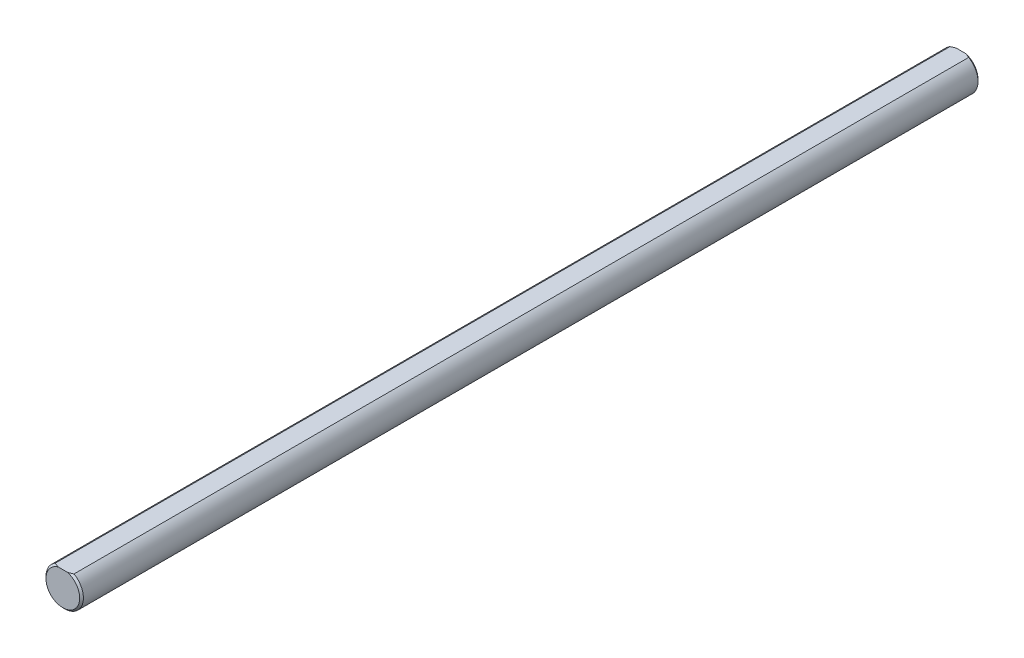
ISO-10303-21;
HEADER;
FILE_DESCRIPTION(('STEP AP214'),'2;1');
FILE_NAME('part.step','',(''),(''),'','','');
FILE_SCHEMA(('AUTOMOTIVE_DESIGN { 1 0 10303 214 1 1 1 1 }'));
ENDSEC;
DATA;
#1=APPLICATION_CONTEXT('core data for automotive mechanical design processes');
#2=APPLICATION_PROTOCOL_DEFINITION('international standard','automotive_design',2000,#1);
#3=PRODUCT_CONTEXT('',#1,'mechanical');
#4=PRODUCT('Part','Part','',(#3));
#5=PRODUCT_RELATED_PRODUCT_CATEGORY('part','',(#4));
#6=PRODUCT_DEFINITION_FORMATION('','',#4);
#7=PRODUCT_DEFINITION_CONTEXT('part definition',#1,'design');
#8=PRODUCT_DEFINITION('design','',#6,#7);
#9=PRODUCT_DEFINITION_SHAPE('','',#8);
#10=(LENGTH_UNIT() NAMED_UNIT(*) SI_UNIT(.MILLI.,.METRE.));
#11=(NAMED_UNIT(*) PLANE_ANGLE_UNIT() SI_UNIT($,.RADIAN.));
#12=(NAMED_UNIT(*) SI_UNIT($,.STERADIAN.) SOLID_ANGLE_UNIT());
#13=UNCERTAINTY_MEASURE_WITH_UNIT(LENGTH_MEASURE(1.E-05),#10,'distance_accuracy_value','');
#14=(GEOMETRIC_REPRESENTATION_CONTEXT(3) GLOBAL_UNCERTAINTY_ASSIGNED_CONTEXT((#13)) GLOBAL_UNIT_ASSIGNED_CONTEXT((#10,
#11,#12)) REPRESENTATION_CONTEXT('',''));
#15=CARTESIAN_POINT('',(0.,0.,0.));
#16=DIRECTION('',(0.,0.,1.));
#17=DIRECTION('',(1.,0.,0.));
#18=AXIS2_PLACEMENT_3D('',#15,#16,#17);
#19=CARTESIAN_POINT('',(0.,0.,76.2));
#20=DIRECTION('',(0.,0.,-1.));
#21=DIRECTION('',(-1.,0.,0.));
#22=AXIS2_PLACEMENT_3D('',#19,#20,#21);
#23=CYLINDRICAL_SURFACE('',#22,3.175);
#24=DIRECTION('',(0.,0.,1.));
#25=VECTOR('',#24,1.);
#26=CARTESIAN_POINT('',(-1.5875,2.74963065701559,-76.2));
#27=LINE('',#26,#25);
#28=CARTESIAN_POINT('',(-1.5875,2.74963065701559,-75.8824999999998));
#29=VERTEX_POINT('',#28);
#30=CARTESIAN_POINT('',(-1.5875,2.74963065701559,75.8825000000001));
#31=VERTEX_POINT('',#30);
#32=EDGE_CURVE('E87',#29,#31,#27,.T.);
#33=ORIENTED_EDGE('',*,*,#32,.F.);
#34=CARTESIAN_POINT('',(0.,0.,-75.8824999999998));
#35=DIRECTION('',(0.,0.,1.));
#36=DIRECTION('',(1.,0.,0.));
#37=AXIS2_PLACEMENT_3D('',#34,#35,#36);
#38=CIRCLE('',#37,3.175);
#39=CARTESIAN_POINT('',(1.5875,2.74963065701559,-75.8824999999998));
#40=VERTEX_POINT('',#39);
#41=EDGE_CURVE('E97',#29,#40,#38,.T.);
#42=ORIENTED_EDGE('',*,*,#41,.T.);
#43=DIRECTION('',(0.,0.,1.));
#44=VECTOR('',#43,1.);
#45=CARTESIAN_POINT('',(1.5875,2.74963065701559,-76.2));
#46=LINE('',#45,#44);
#47=CARTESIAN_POINT('',(1.5875,2.74963065701559,75.8825000000001));
#48=VERTEX_POINT('',#47);
#49=EDGE_CURVE('E100',#40,#48,#46,.T.);
#50=ORIENTED_EDGE('',*,*,#49,.T.);
#51=CARTESIAN_POINT('',(0.,0.,75.8825000000001));
#52=DIRECTION('',(0.,0.,1.));
#53=DIRECTION('',(1.,0.,0.));
#54=AXIS2_PLACEMENT_3D('',#51,#52,#53);
#55=CIRCLE('',#54,3.175);
#56=EDGE_CURVE('E96',#48,#31,#55,.F.);
#57=ORIENTED_EDGE('',*,*,#56,.T.);
#58=EDGE_LOOP('',(#33,#42,#50,#57));
#59=FACE_BOUND('',#58,.T.);
#60=ADVANCED_FACE('F39',(#59),#23,.T.);
#61=CARTESIAN_POINT('',(0.,0.,76.2));
#62=DIRECTION('',(0.,0.,1.));
#63=DIRECTION('',(1.,0.,0.));
#64=AXIS2_PLACEMENT_3D('',#61,#62,#63);
#65=PLANE('',#64);
#66=DIRECTION('',(1.,0.,0.));
#67=VECTOR('',#66,1.);
#68=CARTESIAN_POINT('',(-1.5875,2.74963065701559,76.2));
#69=LINE('',#68,#67);
#70=CARTESIAN_POINT('',(-0.777712993334062,2.74963065701559,76.2));
#71=VERTEX_POINT('',#70);
#72=CARTESIAN_POINT('',(0.777712993334062,2.74963065701559,76.2));
#73=VERTEX_POINT('',#72);
#74=EDGE_CURVE('E144',#71,#73,#69,.T.);
#75=ORIENTED_EDGE('',*,*,#74,.F.);
#76=CARTESIAN_POINT('',(0.,0.,76.2));
#77=DIRECTION('',(0.,0.,1.));
#78=DIRECTION('',(1.,0.,0.));
#79=AXIS2_PLACEMENT_3D('',#76,#77,#78);
#80=CIRCLE('',#79,2.85750000000011);
#81=EDGE_CURVE('E11',#71,#73,#80,.T.);
#82=ORIENTED_EDGE('',*,*,#81,.T.);
#83=EDGE_LOOP('',(#75,#82));
#84=FACE_BOUND('',#83,.T.);
#85=ADVANCED_FACE('F139',(#84),#65,.T.);
#86=CARTESIAN_POINT('',(0.,0.,-76.2));
#87=DIRECTION('',(0.,0.,1.));
#88=DIRECTION('',(1.,0.,0.));
#89=AXIS2_PLACEMENT_3D('',#86,#87,#88);
#90=PLANE('',#89);
#91=DIRECTION('',(1.,0.,0.));
#92=VECTOR('',#91,1.);
#93=CARTESIAN_POINT('',(-1.5875,2.74963065701559,-76.2));
#94=LINE('',#93,#92);
#95=CARTESIAN_POINT('',(-0.77771299333294,2.74963065701559,-76.2));
#96=VERTEX_POINT('',#95);
#97=CARTESIAN_POINT('',(0.77771299333294,2.74963065701559,-76.2));
#98=VERTEX_POINT('',#97);
#99=EDGE_CURVE('E89',#96,#98,#94,.T.);
#100=ORIENTED_EDGE('',*,*,#99,.T.);
#101=CARTESIAN_POINT('',(0.,0.,-76.2));
#102=DIRECTION('',(0.,0.,1.));
#103=DIRECTION('',(1.,0.,0.));
#104=AXIS2_PLACEMENT_3D('',#101,#102,#103);
#105=CIRCLE('',#104,2.8574999999998);
#106=EDGE_CURVE('E48',#98,#96,#105,.F.);
#107=ORIENTED_EDGE('',*,*,#106,.T.);
#108=EDGE_LOOP('',(#100,#107));
#109=FACE_BOUND('',#108,.T.);
#110=ADVANCED_FACE('F117',(#109),#90,.F.);
#111=CARTESIAN_POINT('',(-1.5875,2.74963065701559,-76.2));
#112=DIRECTION('',(0.,-1.,0.));
#113=DIRECTION('',(0.,0.,-1.));
#114=AXIS2_PLACEMENT_3D('',#111,#112,#113);
#115=PLANE('',#114);
#116=ORIENTED_EDGE('',*,*,#49,.F.);
#117=CARTESIAN_POINT('',(1.5875,2.74963065701559,-75.8824999999998));
#118=CARTESIAN_POINT('',(1.52250516699264,2.74963065701559,-75.9149880824797));
#119=CARTESIAN_POINT('',(1.45690188238018,2.74963065701559,-75.9463019076192));
#120=CARTESIAN_POINT('',(1.32458227076999,2.74963065701559,-76.0060258514251));
#121=CARTESIAN_POINT('',(1.25786903887704,2.74963065701559,-76.0344428470168));
#122=CARTESIAN_POINT('',(1.12308918002457,2.74963065701559,-76.0879920057044));
#123=CARTESIAN_POINT('',(1.05502199036131,2.74963065701559,-76.1131227687341));
#124=CARTESIAN_POINT('',(0.917422256787398,2.74963065701559,-76.1595821959476));
#125=CARTESIAN_POINT('',(0.84788654327487,2.74963065701559,-76.1809014355307));
#126=CARTESIAN_POINT('',(0.777712993332939,2.74963065701559,-76.2));
#127=B_SPLINE_CURVE_WITH_KNOTS('',3,(#117,#118,#119,#120,#121,#122,#123,#124,#125,#126),
.UNSPECIFIED.,.F.,.F.,(4,2,2,2,4),(0.,0.218002568777967,0.435474929897523,0.653039643131099,
0.871135095681305),.UNSPECIFIED.);
#128=EDGE_CURVE('E94',#40,#98,#127,.T.);
#129=ORIENTED_EDGE('',*,*,#128,.T.);
#130=ORIENTED_EDGE('',*,*,#99,.F.);
#131=CARTESIAN_POINT('',(-0.77771299333294,2.74963065701559,-76.2));
#132=CARTESIAN_POINT('',(-0.847886543274871,2.74963065701559,-76.1809014355307));
#133=CARTESIAN_POINT('',(-0.917422256787399,2.74963065701559,-76.1595821959476));
#134=CARTESIAN_POINT('',(-1.05502199036131,2.74963065701559,-76.1131227687341));
#135=CARTESIAN_POINT('',(-1.12308918002457,2.74963065701559,-76.0879920057044));
#136=CARTESIAN_POINT('',(-1.25786903887704,2.74963065701559,-76.0344428470168));
#137=CARTESIAN_POINT('',(-1.32458227076999,2.74963065701559,-76.0060258514251));
#138=CARTESIAN_POINT('',(-1.45690188238018,2.74963065701559,-75.9463019076192));
#139=CARTESIAN_POINT('',(-1.52250516699264,2.74963065701559,-75.9149880824797));
#140=CARTESIAN_POINT('',(-1.5875,2.74963065701559,-75.8824999999998));
#141=B_SPLINE_CURVE_WITH_KNOTS('',3,(#131,#132,#133,#134,#135,#136,#137,#138,#139,#140),
.UNSPECIFIED.,.F.,.F.,(4,2,2,2,4),(0.,0.218095452550206,0.435660165783782,0.653132526903341,
0.871135095681305),.UNSPECIFIED.);
#142=EDGE_CURVE('E84',#96,#29,#141,.T.);
#143=ORIENTED_EDGE('',*,*,#142,.T.);
#144=ORIENTED_EDGE('',*,*,#32,.T.);
#145=CARTESIAN_POINT('',(-1.5875,2.74963065701559,75.8825000000001));
#146=CARTESIAN_POINT('',(-1.52250516699273,2.74963065701559,75.91498808248));
#147=CARTESIAN_POINT('',(-1.45690188238036,2.74963065701559,75.9463019076195));
#148=CARTESIAN_POINT('',(-1.32458227077035,2.74963065701559,76.0060258514252));
#149=CARTESIAN_POINT('',(-1.25786903887749,2.74963065701559,76.0344428470169));
#150=CARTESIAN_POINT('',(-1.12308918002521,2.74963065701559,76.0879920057045));
#151=CARTESIAN_POINT('',(-1.05502199036204,2.74963065701559,76.1131227687342));
#152=CARTESIAN_POINT('',(-0.91742225678832,2.74963065701559,76.1595821959476));
#153=CARTESIAN_POINT('',(-0.847886543275889,2.74963065701559,76.1809014355307));
#154=CARTESIAN_POINT('',(-0.777712993334062,2.74963065701559,76.2));
#155=B_SPLINE_CURVE_WITH_KNOTS('',3,(#145,#146,#147,#148,#149,#150,#151,#152,#153,#154),
.UNSPECIFIED.,.F.,.F.,(4,2,2,2,4),(0.,0.218002568777676,0.435474929896942,0.653039643130223,
0.871135095680142),.UNSPECIFIED.);
#156=EDGE_CURVE('E64',#31,#71,#155,.T.);
#157=ORIENTED_EDGE('',*,*,#156,.T.);
#158=ORIENTED_EDGE('',*,*,#74,.T.);
#159=CARTESIAN_POINT('',(0.777712993334062,2.74963065701559,76.2));
#160=CARTESIAN_POINT('',(0.847886543275889,2.74963065701559,76.1809014355307));
#161=CARTESIAN_POINT('',(0.917422256788319,2.74963065701559,76.1595821959476));
#162=CARTESIAN_POINT('',(1.05502199036204,2.74963065701559,76.1131227687342));
#163=CARTESIAN_POINT('',(1.12308918002521,2.74963065701559,76.0879920057045));
#164=CARTESIAN_POINT('',(1.25786903887749,2.74963065701559,76.0344428470169));
#165=CARTESIAN_POINT('',(1.32458227077035,2.74963065701559,76.0060258514252));
#166=CARTESIAN_POINT('',(1.45690188238036,2.74963065701559,75.9463019076195));
#167=CARTESIAN_POINT('',(1.52250516699273,2.74963065701559,75.91498808248));
#168=CARTESIAN_POINT('',(1.5875,2.74963065701559,75.8825000000001));
#169=B_SPLINE_CURVE_WITH_KNOTS('',3,(#159,#160,#161,#162,#163,#164,#165,#166,#167,#168),
.UNSPECIFIED.,.F.,.F.,(4,2,2,2,4),(0.,0.21809545254992,0.4356601657832,0.653132526902467,
0.871135095680142),.UNSPECIFIED.);
#170=EDGE_CURVE('E54',#73,#48,#169,.T.);
#171=ORIENTED_EDGE('',*,*,#170,.T.);
#172=EDGE_LOOP('',(#116,#129,#130,#143,#144,#157,#158,#171));
#173=FACE_BOUND('',#172,.T.);
#174=ADVANCED_FACE('F81',(#173),#115,.F.);
#175=CARTESIAN_POINT('',(0.,0.,-75.8824999999998));
#176=DIRECTION('',(0.,0.,1.));
#177=DIRECTION('',(1.,0.,0.));
#178=AXIS2_PLACEMENT_3D('',#175,#176,#177);
#179=CONICAL_SURFACE('',#178,3.175,0.785398163397453);
#180=ORIENTED_EDGE('',*,*,#142,.F.);
#181=ORIENTED_EDGE('',*,*,#106,.F.);
#182=ORIENTED_EDGE('',*,*,#128,.F.);
#183=ORIENTED_EDGE('',*,*,#41,.F.);
#184=EDGE_LOOP('',(#180,#181,#182,#183));
#185=FACE_BOUND('',#184,.T.);
#186=ADVANCED_FACE('F103',(#185),#179,.T.);
#187=CARTESIAN_POINT('',(0.,0.,76.2));
#188=DIRECTION('',(0.,0.,-1.));
#189=DIRECTION('',(-1.,0.,0.));
#190=AXIS2_PLACEMENT_3D('',#187,#188,#189);
#191=CONICAL_SURFACE('',#190,2.85750000000011,0.785398163397453);
#192=ORIENTED_EDGE('',*,*,#156,.F.);
#193=ORIENTED_EDGE('',*,*,#56,.F.);
#194=ORIENTED_EDGE('',*,*,#170,.F.);
#195=ORIENTED_EDGE('',*,*,#81,.F.);
#196=EDGE_LOOP('',(#192,#193,#194,#195));
#197=FACE_BOUND('',#196,.T.);
#198=ADVANCED_FACE('F41',(#197),#191,.T.);
#199=CLOSED_SHELL('',(#60,#85,#110,#174,#186,#198));
#200=MANIFOLD_SOLID_BREP('B2',#199);
#201=ADVANCED_BREP_SHAPE_REPRESENTATION('',(#18,#200),#14);
#202=SHAPE_DEFINITION_REPRESENTATION(#9,#201);
ENDSEC;
END-ISO-10303-21;
